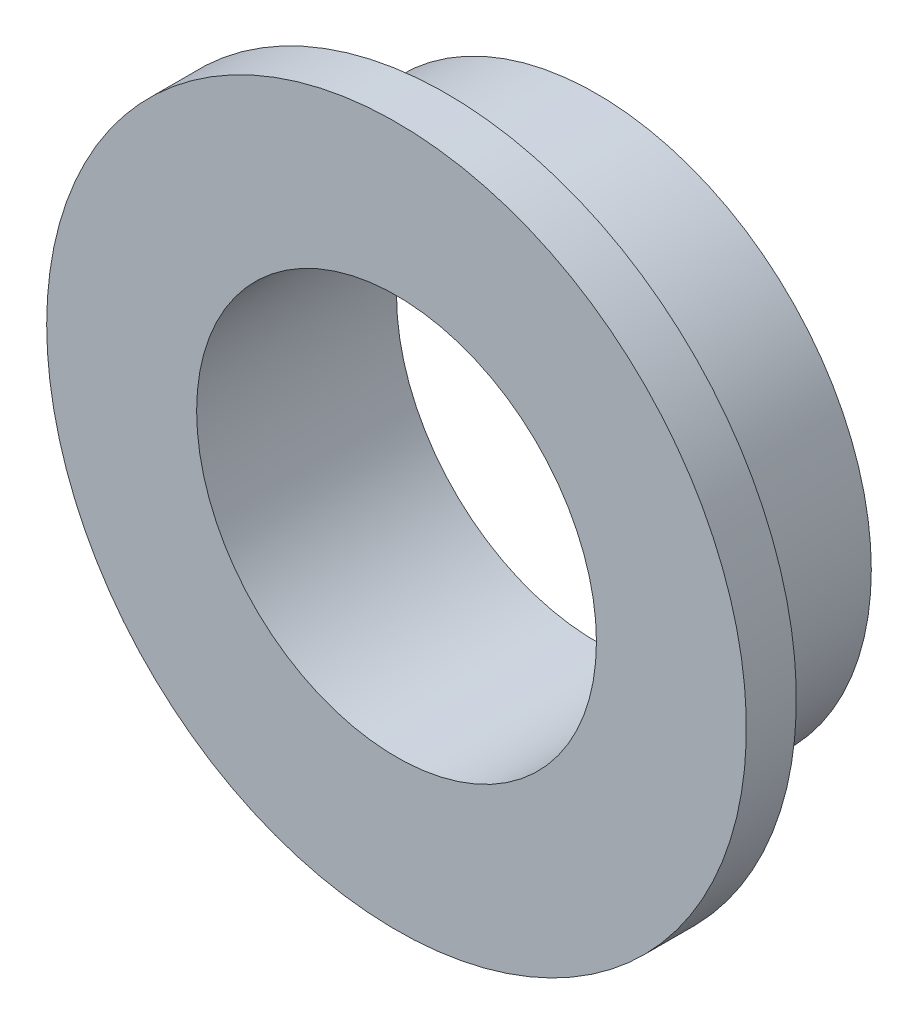
ISO-10303-21;
HEADER;
FILE_DESCRIPTION(('STEP AP214'),'2;1');
FILE_NAME('part.step','',(''),(''),'','','');
FILE_SCHEMA(('AUTOMOTIVE_DESIGN { 1 0 10303 214 1 1 1 1 }'));
ENDSEC;
DATA;
#1=APPLICATION_CONTEXT('core data for automotive mechanical design processes');
#2=APPLICATION_PROTOCOL_DEFINITION('international standard','automotive_design',2000,#1);
#3=PRODUCT_CONTEXT('',#1,'mechanical');
#4=PRODUCT('Part','Part','',(#3));
#5=PRODUCT_RELATED_PRODUCT_CATEGORY('part','',(#4));
#6=PRODUCT_DEFINITION_FORMATION('','',#4);
#7=PRODUCT_DEFINITION_CONTEXT('part definition',#1,'design');
#8=PRODUCT_DEFINITION('design','',#6,#7);
#9=PRODUCT_DEFINITION_SHAPE('','',#8);
#10=(LENGTH_UNIT() NAMED_UNIT(*) SI_UNIT(.MILLI.,.METRE.));
#11=(NAMED_UNIT(*) PLANE_ANGLE_UNIT() SI_UNIT($,.RADIAN.));
#12=(NAMED_UNIT(*) SI_UNIT($,.STERADIAN.) SOLID_ANGLE_UNIT());
#13=UNCERTAINTY_MEASURE_WITH_UNIT(LENGTH_MEASURE(1.E-05),#10,'distance_accuracy_value','');
#14=(GEOMETRIC_REPRESENTATION_CONTEXT(3) GLOBAL_UNCERTAINTY_ASSIGNED_CONTEXT((#13)) GLOBAL_UNIT_ASSIGNED_CONTEXT((#10,
#11,#12)) REPRESENTATION_CONTEXT('',''));
#15=CARTESIAN_POINT('',(0.,0.,0.));
#16=DIRECTION('',(0.,0.,1.));
#17=DIRECTION('',(1.,0.,0.));
#18=AXIS2_PLACEMENT_3D('',#15,#16,#17);
#19=CARTESIAN_POINT('',(0.,5.5,0.));
#20=DIRECTION('',(0.,0.,-1.));
#21=DIRECTION('',(-1.,0.,0.));
#22=AXIS2_PLACEMENT_3D('',#19,#20,#21);
#23=PLANE('',#22);
#24=CARTESIAN_POINT('',(0.,0.,0.));
#25=DIRECTION('',(0.,0.,-1.));
#26=DIRECTION('',(-1.,0.,0.));
#27=AXIS2_PLACEMENT_3D('',#24,#25,#26);
#28=CIRCLE('',#27,5.5);
#29=CARTESIAN_POINT('',(-5.5,0.,0.));
#30=VERTEX_POINT('',#29);
#31=EDGE_CURVE('E52',#30,#30,#28,.T.);
#32=ORIENTED_EDGE('',*,*,#31,.T.);
#33=EDGE_LOOP('',(#32));
#34=FACE_BOUND('',#33,.T.);
#35=CARTESIAN_POINT('',(0.,0.,0.));
#36=DIRECTION('',(0.,0.,-1.));
#37=DIRECTION('',(-1.,0.,0.));
#38=AXIS2_PLACEMENT_3D('',#35,#36,#37);
#39=CIRCLE('',#38,4.);
#40=CARTESIAN_POINT('',(-4.,0.,0.));
#41=VERTEX_POINT('',#40);
#42=EDGE_CURVE('E10',#41,#41,#39,.T.);
#43=ORIENTED_EDGE('',*,*,#42,.F.);
#44=EDGE_LOOP('',(#43));
#45=FACE_BOUND('',#44,.T.);
#46=ADVANCED_FACE('F30',(#34,#45),#23,.T.);
#47=CARTESIAN_POINT('',(0.,0.,0.));
#48=DIRECTION('',(0.,0.,-1.));
#49=DIRECTION('',(-1.,0.,0.));
#50=AXIS2_PLACEMENT_3D('',#47,#48,#49);
#51=CYLINDRICAL_SURFACE('',#50,4.);
#52=ORIENTED_EDGE('',*,*,#42,.T.);
#53=EDGE_LOOP('',(#52));
#54=FACE_BOUND('',#53,.T.);
#55=CARTESIAN_POINT('',(0.,0.,4.));
#56=DIRECTION('',(0.,0.,-1.));
#57=DIRECTION('',(-1.,0.,0.));
#58=AXIS2_PLACEMENT_3D('',#55,#56,#57);
#59=CIRCLE('',#58,4.);
#60=CARTESIAN_POINT('',(-4.,0.,4.));
#61=VERTEX_POINT('',#60);
#62=EDGE_CURVE('E36',#61,#61,#59,.T.);
#63=ORIENTED_EDGE('',*,*,#62,.F.);
#64=EDGE_LOOP('',(#63));
#65=FACE_BOUND('',#64,.T.);
#66=ADVANCED_FACE('F70',(#54,#65),#51,.F.);
#67=CARTESIAN_POINT('',(0.,4.,4.));
#68=DIRECTION('',(0.,0.,1.));
#69=DIRECTION('',(1.,0.,0.));
#70=AXIS2_PLACEMENT_3D('',#67,#68,#69);
#71=PLANE('',#70);
#72=ORIENTED_EDGE('',*,*,#62,.T.);
#73=EDGE_LOOP('',(#72));
#74=FACE_BOUND('',#73,.T.);
#75=CARTESIAN_POINT('',(0.,0.,4.));
#76=DIRECTION('',(0.,0.,-1.));
#77=DIRECTION('',(-1.,0.,0.));
#78=AXIS2_PLACEMENT_3D('',#75,#76,#77);
#79=CIRCLE('',#78,7.);
#80=CARTESIAN_POINT('',(-7.,0.,4.));
#81=VERTEX_POINT('',#80);
#82=EDGE_CURVE('E40',#81,#81,#79,.T.);
#83=ORIENTED_EDGE('',*,*,#82,.F.);
#84=EDGE_LOOP('',(#83));
#85=FACE_BOUND('',#84,.T.);
#86=ADVANCED_FACE('F74',(#74,#85),#71,.T.);
#87=CARTESIAN_POINT('',(0.,0.,0.));
#88=DIRECTION('',(0.,0.,-1.));
#89=DIRECTION('',(-1.,0.,0.));
#90=AXIS2_PLACEMENT_3D('',#87,#88,#89);
#91=CYLINDRICAL_SURFACE('',#90,7.);
#92=ORIENTED_EDGE('',*,*,#82,.T.);
#93=EDGE_LOOP('',(#92));
#94=FACE_BOUND('',#93,.T.);
#95=CARTESIAN_POINT('',(0.,0.,3.));
#96=DIRECTION('',(0.,0.,-1.));
#97=DIRECTION('',(-1.,0.,0.));
#98=AXIS2_PLACEMENT_3D('',#95,#96,#97);
#99=CIRCLE('',#98,7.);
#100=CARTESIAN_POINT('',(-7.,0.,3.));
#101=VERTEX_POINT('',#100);
#102=EDGE_CURVE('E44',#101,#101,#99,.T.);
#103=ORIENTED_EDGE('',*,*,#102,.F.);
#104=EDGE_LOOP('',(#103));
#105=FACE_BOUND('',#104,.T.);
#106=ADVANCED_FACE('F66',(#94,#105),#91,.T.);
#107=CARTESIAN_POINT('',(0.,7.,3.));
#108=DIRECTION('',(0.,0.,-1.));
#109=DIRECTION('',(-1.,0.,0.));
#110=AXIS2_PLACEMENT_3D('',#107,#108,#109);
#111=PLANE('',#110);
#112=ORIENTED_EDGE('',*,*,#102,.T.);
#113=EDGE_LOOP('',(#112));
#114=FACE_BOUND('',#113,.T.);
#115=CARTESIAN_POINT('',(0.,0.,3.));
#116=DIRECTION('',(0.,0.,-1.));
#117=DIRECTION('',(-1.,0.,0.));
#118=AXIS2_PLACEMENT_3D('',#115,#116,#117);
#119=CIRCLE('',#118,5.5);
#120=CARTESIAN_POINT('',(-5.5,0.,3.));
#121=VERTEX_POINT('',#120);
#122=EDGE_CURVE('E49',#121,#121,#119,.T.);
#123=ORIENTED_EDGE('',*,*,#122,.F.);
#124=EDGE_LOOP('',(#123));
#125=FACE_BOUND('',#124,.T.);
#126=ADVANCED_FACE('F60',(#114,#125),#111,.T.);
#127=CARTESIAN_POINT('',(0.,0.,0.));
#128=DIRECTION('',(0.,0.,-1.));
#129=DIRECTION('',(-1.,0.,0.));
#130=AXIS2_PLACEMENT_3D('',#127,#128,#129);
#131=CYLINDRICAL_SURFACE('',#130,5.5);
#132=ORIENTED_EDGE('',*,*,#122,.T.);
#133=EDGE_LOOP('',(#132));
#134=FACE_BOUND('',#133,.T.);
#135=ORIENTED_EDGE('',*,*,#31,.F.);
#136=EDGE_LOOP('',(#135));
#137=FACE_BOUND('',#136,.T.);
#138=ADVANCED_FACE('F58',(#134,#137),#131,.T.);
#139=CLOSED_SHELL('',(#46,#66,#86,#106,#126,#138));
#140=MANIFOLD_SOLID_BREP('B2',#139);
#141=ADVANCED_BREP_SHAPE_REPRESENTATION('',(#18,#140),#14);
#142=SHAPE_DEFINITION_REPRESENTATION(#9,#141);
ENDSEC;
END-ISO-10303-21;
